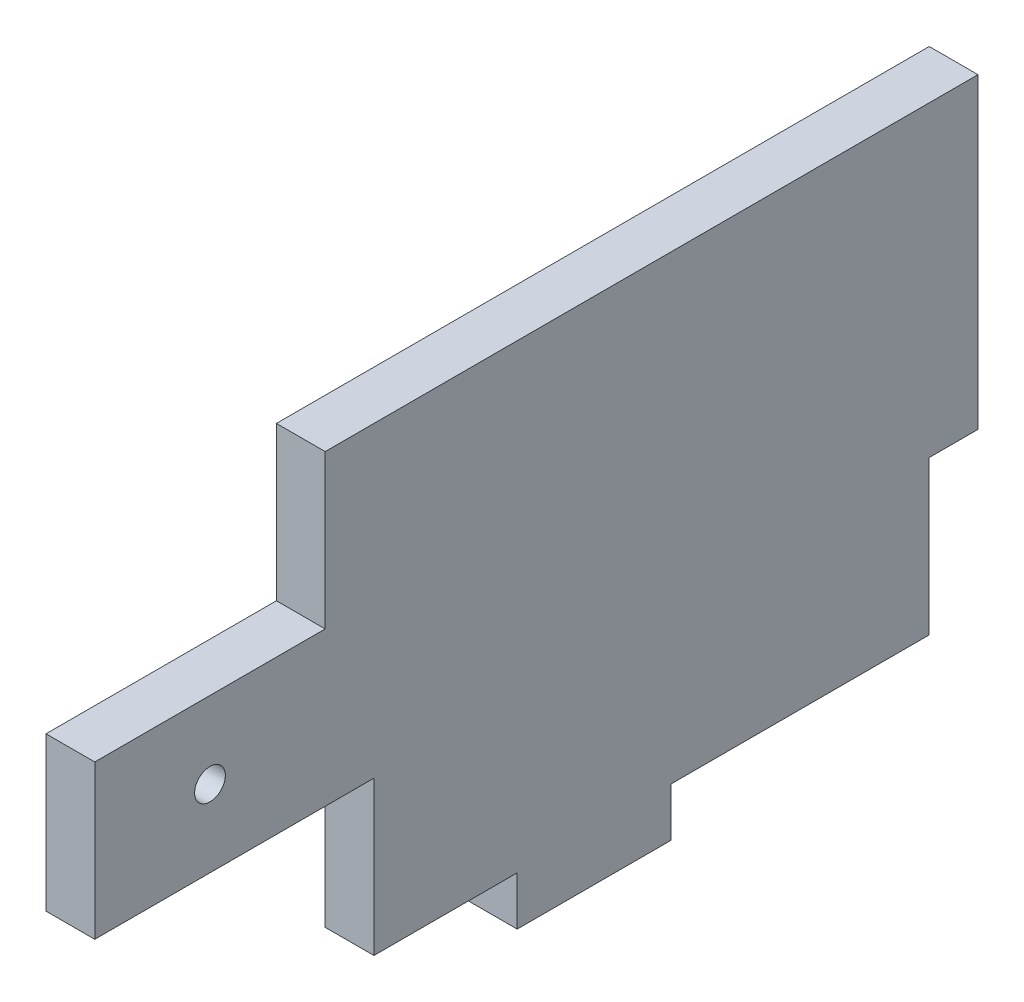
ISO-10303-21;
HEADER;
FILE_DESCRIPTION(('STEP AP214'),'2;1');
FILE_NAME('part.step','',(''),(''),'','','');
FILE_SCHEMA(('AUTOMOTIVE_DESIGN { 1 0 10303 214 1 1 1 1 }'));
ENDSEC;
DATA;
#1=APPLICATION_CONTEXT('core data for automotive mechanical design processes');
#2=APPLICATION_PROTOCOL_DEFINITION('international standard','automotive_design',2000,#1);
#3=PRODUCT_CONTEXT('',#1,'mechanical');
#4=PRODUCT('Part','Part','',(#3));
#5=PRODUCT_RELATED_PRODUCT_CATEGORY('part','',(#4));
#6=PRODUCT_DEFINITION_FORMATION('','',#4);
#7=PRODUCT_DEFINITION_CONTEXT('part definition',#1,'design');
#8=PRODUCT_DEFINITION('design','',#6,#7);
#9=PRODUCT_DEFINITION_SHAPE('','',#8);
#10=(LENGTH_UNIT() NAMED_UNIT(*) SI_UNIT(.MILLI.,.METRE.));
#11=(NAMED_UNIT(*) PLANE_ANGLE_UNIT() SI_UNIT($,.RADIAN.));
#12=(NAMED_UNIT(*) SI_UNIT($,.STERADIAN.) SOLID_ANGLE_UNIT());
#13=UNCERTAINTY_MEASURE_WITH_UNIT(LENGTH_MEASURE(1.E-05),#10,'distance_accuracy_value','');
#14=(GEOMETRIC_REPRESENTATION_CONTEXT(3) GLOBAL_UNCERTAINTY_ASSIGNED_CONTEXT((#13)) GLOBAL_UNIT_ASSIGNED_CONTEXT((#10,
#11,#12)) REPRESENTATION_CONTEXT('',''));
#15=CARTESIAN_POINT('',(0.,0.,0.));
#16=DIRECTION('',(0.,0.,1.));
#17=DIRECTION('',(1.,0.,0.));
#18=AXIS2_PLACEMENT_3D('',#15,#16,#17);
#19=CARTESIAN_POINT('',(12.7,0.,-85.));
#20=DIRECTION('',(0.,0.,1.));
#21=DIRECTION('',(1.,0.,0.));
#22=AXIS2_PLACEMENT_3D('',#19,#20,#21);
#23=PLANE('',#22);
#24=DIRECTION('',(0.,1.,0.));
#25=VECTOR('',#24,1.);
#26=CARTESIAN_POINT('',(12.7,0.,-85.));
#27=LINE('',#26,#25);
#28=CARTESIAN_POINT('',(12.7,-19.9999999999996,-85.));
#29=VERTEX_POINT('',#28);
#30=CARTESIAN_POINT('',(12.7,60.,-85.));
#31=VERTEX_POINT('',#30);
#32=EDGE_CURVE('E241',#29,#31,#27,.T.);
#33=ORIENTED_EDGE('',*,*,#32,.F.);
#34=DIRECTION('',(1.,0.,0.));
#35=VECTOR('',#34,1.);
#36=CARTESIAN_POINT('',(0.,-19.9999999999996,-85.));
#37=LINE('',#36,#35);
#38=CARTESIAN_POINT('',(0.,-19.9999999999996,-85.));
#39=VERTEX_POINT('',#38);
#40=EDGE_CURVE('E288',#39,#29,#37,.T.);
#41=ORIENTED_EDGE('',*,*,#40,.F.);
#42=DIRECTION('',(0.,1.,0.));
#43=VECTOR('',#42,1.);
#44=CARTESIAN_POINT('',(0.,0.,-85.));
#45=LINE('',#44,#43);
#46=CARTESIAN_POINT('',(0.,60.,-85.));
#47=VERTEX_POINT('',#46);
#48=EDGE_CURVE('E256',#39,#47,#45,.T.);
#49=ORIENTED_EDGE('',*,*,#48,.T.);
#50=DIRECTION('',(-1.,0.,0.));
#51=VECTOR('',#50,1.);
#52=CARTESIAN_POINT('',(12.7,60.,-85.));
#53=LINE('',#52,#51);
#54=EDGE_CURVE('E171',#31,#47,#53,.T.);
#55=ORIENTED_EDGE('',*,*,#54,.F.);
#56=EDGE_LOOP('',(#33,#41,#49,#55));
#57=FACE_BOUND('',#56,.T.);
#58=ADVANCED_FACE('F71',(#57),#23,.F.);
#59=CARTESIAN_POINT('',(12.7,60.,0.));
#60=DIRECTION('',(0.,1.,0.));
#61=DIRECTION('',(0.,0.,1.));
#62=AXIS2_PLACEMENT_3D('',#59,#60,#61);
#63=PLANE('',#62);
#64=DIRECTION('',(0.,0.,-1.));
#65=VECTOR('',#64,1.);
#66=CARTESIAN_POINT('',(0.,60.,0.));
#67=LINE('',#66,#65);
#68=CARTESIAN_POINT('',(0.,60.,85.));
#69=VERTEX_POINT('',#68);
#70=EDGE_CURVE('E260',#69,#47,#67,.T.);
#71=ORIENTED_EDGE('',*,*,#70,.F.);
#72=DIRECTION('',(-1.,0.,0.));
#73=VECTOR('',#72,1.);
#74=CARTESIAN_POINT('',(12.7,60.,85.));
#75=LINE('',#74,#73);
#76=CARTESIAN_POINT('',(12.7,60.,85.));
#77=VERTEX_POINT('',#76);
#78=EDGE_CURVE('E180',#77,#69,#75,.T.);
#79=ORIENTED_EDGE('',*,*,#78,.F.);
#80=DIRECTION('',(0.,0.,-1.));
#81=VECTOR('',#80,1.);
#82=CARTESIAN_POINT('',(12.7,60.,0.));
#83=LINE('',#82,#81);
#84=EDGE_CURVE('E246',#77,#31,#83,.T.);
#85=ORIENTED_EDGE('',*,*,#84,.T.);
#86=ORIENTED_EDGE('',*,*,#54,.T.);
#87=EDGE_LOOP('',(#71,#79,#85,#86));
#88=FACE_BOUND('',#87,.T.);
#89=ADVANCED_FACE('F349',(#88),#63,.T.);
#90=CARTESIAN_POINT('',(12.7,-60.,0.));
#91=DIRECTION('',(0.,1.,0.));
#92=DIRECTION('',(0.,0.,1.));
#93=AXIS2_PLACEMENT_3D('',#90,#91,#92);
#94=PLANE('',#93);
#95=DIRECTION('',(0.,0.,-1.));
#96=VECTOR('',#95,1.);
#97=CARTESIAN_POINT('',(12.7,-60.,0.));
#98=LINE('',#97,#96);
#99=CARTESIAN_POINT('',(12.7,-60.,72.3));
#100=VERTEX_POINT('',#99);
#101=CARTESIAN_POINT('',(12.7,-60.,35.));
#102=VERTEX_POINT('',#101);
#103=EDGE_CURVE('E238',#100,#102,#98,.T.);
#104=ORIENTED_EDGE('',*,*,#103,.F.);
#105=DIRECTION('',(1.,0.,0.));
#106=VECTOR('',#105,1.);
#107=CARTESIAN_POINT('',(0.,-60.,72.3));
#108=LINE('',#107,#106);
#109=CARTESIAN_POINT('',(0.,-60.,72.3));
#110=VERTEX_POINT('',#109);
#111=EDGE_CURVE('E227',#110,#100,#108,.T.);
#112=ORIENTED_EDGE('',*,*,#111,.F.);
#113=DIRECTION('',(0.,0.,-1.));
#114=VECTOR('',#113,1.);
#115=CARTESIAN_POINT('',(0.,-60.,0.));
#116=LINE('',#115,#114);
#117=CARTESIAN_POINT('',(0.,-60.,35.));
#118=VERTEX_POINT('',#117);
#119=EDGE_CURVE('E252',#110,#118,#116,.T.);
#120=ORIENTED_EDGE('',*,*,#119,.T.);
#121=DIRECTION('',(-1.,0.,0.));
#122=VECTOR('',#121,1.);
#123=CARTESIAN_POINT('',(12.7,-60.,35.));
#124=LINE('',#123,#122);
#125=EDGE_CURVE('E12',#102,#118,#124,.T.);
#126=ORIENTED_EDGE('',*,*,#125,.F.);
#127=EDGE_LOOP('',(#104,#112,#120,#126));
#128=FACE_BOUND('',#127,.T.);
#129=ADVANCED_FACE('F323',(#128),#94,.F.);
#130=CARTESIAN_POINT('',(0.,0.,0.));
#131=DIRECTION('',(1.,0.,0.));
#132=DIRECTION('',(0.,0.,-1.));
#133=AXIS2_PLACEMENT_3D('',#130,#131,#132);
#134=PLANE('',#133);
#135=CARTESIAN_POINT('',(0.,0.,115.));
#136=DIRECTION('',(1.,0.,0.));
#137=DIRECTION('',(0.,0.,-1.));
#138=AXIS2_PLACEMENT_3D('',#135,#136,#137);
#139=CIRCLE('',#138,4.00000000000001);
#140=CARTESIAN_POINT('',(0.,0.,111.));
#141=VERTEX_POINT('',#140);
#142=EDGE_CURVE('E291',#141,#141,#139,.T.);
#143=ORIENTED_EDGE('',*,*,#142,.T.);
#144=EDGE_LOOP('',(#143));
#145=FACE_BOUND('',#144,.T.);
#146=DIRECTION('',(0.,0.,1.));
#147=VECTOR('',#146,1.);
#148=CARTESIAN_POINT('',(0.,-19.9999999999996,-85.));
#149=LINE('',#148,#147);
#150=CARTESIAN_POINT('',(0.,-19.9999999999996,-72.3));
#151=VERTEX_POINT('',#150);
#152=EDGE_CURVE('E298',#39,#151,#149,.T.);
#153=ORIENTED_EDGE('',*,*,#152,.T.);
#154=DIRECTION('',(0.,-1.,0.));
#155=VECTOR('',#154,1.);
#156=CARTESIAN_POINT('',(0.,-60.,-72.3));
#157=LINE('',#156,#155);
#158=CARTESIAN_POINT('',(0.,-60.,-72.3));
#159=VERTEX_POINT('',#158);
#160=EDGE_CURVE('E302',#151,#159,#157,.T.);
#161=ORIENTED_EDGE('',*,*,#160,.T.);
#162=CARTESIAN_POINT('',(0.,-60.,-5.));
#163=VERTEX_POINT('',#162);
#164=EDGE_CURVE('E218',#163,#159,#116,.T.);
#165=ORIENTED_EDGE('',*,*,#164,.F.);
#166=DIRECTION('',(0.,-1.,0.));
#167=VECTOR('',#166,1.);
#168=CARTESIAN_POINT('',(0.,-60.,-5.));
#169=LINE('',#168,#167);
#170=CARTESIAN_POINT('',(0.,-72.7,-5.));
#171=VERTEX_POINT('',#170);
#172=EDGE_CURVE('E204',#163,#171,#169,.T.);
#173=ORIENTED_EDGE('',*,*,#172,.T.);
#174=DIRECTION('',(0.,0.,-1.));
#175=VECTOR('',#174,1.);
#176=CARTESIAN_POINT('',(0.,-72.7,35.));
#177=LINE('',#176,#175);
#178=CARTESIAN_POINT('',(0.,-72.7,35.));
#179=VERTEX_POINT('',#178);
#180=EDGE_CURVE('E208',#179,#171,#177,.T.);
#181=ORIENTED_EDGE('',*,*,#180,.F.);
#182=DIRECTION('',(0.,-1.,0.));
#183=VECTOR('',#182,1.);
#184=CARTESIAN_POINT('',(0.,-60.,35.));
#185=LINE('',#184,#183);
#186=EDGE_CURVE('E197',#118,#179,#185,.T.);
#187=ORIENTED_EDGE('',*,*,#186,.F.);
#188=ORIENTED_EDGE('',*,*,#119,.F.);
#189=DIRECTION('',(0.,1.,0.));
#190=VECTOR('',#189,1.);
#191=CARTESIAN_POINT('',(0.,-60.,72.3));
#192=LINE('',#191,#190);
#193=CARTESIAN_POINT('',(0.,-19.9999999999998,72.3));
#194=VERTEX_POINT('',#193);
#195=EDGE_CURVE('E159',#110,#194,#192,.T.);
#196=ORIENTED_EDGE('',*,*,#195,.T.);
#197=DIRECTION('',(0.,0.,1.));
#198=VECTOR('',#197,1.);
#199=CARTESIAN_POINT('',(0.,-20.,85.));
#200=LINE('',#199,#198);
#201=CARTESIAN_POINT('',(0.,-20.,145.));
#202=VERTEX_POINT('',#201);
#203=EDGE_CURVE('E136',#194,#202,#200,.T.);
#204=ORIENTED_EDGE('',*,*,#203,.T.);
#205=DIRECTION('',(0.,1.,0.));
#206=VECTOR('',#205,1.);
#207=CARTESIAN_POINT('',(0.,-20.,145.));
#208=LINE('',#207,#206);
#209=CARTESIAN_POINT('',(0.,20.,145.));
#210=VERTEX_POINT('',#209);
#211=EDGE_CURVE('E145',#202,#210,#208,.T.);
#212=ORIENTED_EDGE('',*,*,#211,.T.);
#213=DIRECTION('',(0.,0.,1.));
#214=VECTOR('',#213,1.);
#215=CARTESIAN_POINT('',(0.,20.,85.));
#216=LINE('',#215,#214);
#217=CARTESIAN_POINT('',(0.,20.,85.));
#218=VERTEX_POINT('',#217);
#219=EDGE_CURVE('E152',#218,#210,#216,.T.);
#220=ORIENTED_EDGE('',*,*,#219,.F.);
#221=DIRECTION('',(0.,1.,0.));
#222=VECTOR('',#221,1.);
#223=CARTESIAN_POINT('',(0.,0.,85.));
#224=LINE('',#223,#222);
#225=EDGE_CURVE('E262',#218,#69,#224,.T.);
#226=ORIENTED_EDGE('',*,*,#225,.T.);
#227=ORIENTED_EDGE('',*,*,#70,.T.);
#228=ORIENTED_EDGE('',*,*,#48,.F.);
#229=EDGE_LOOP('',(#153,#161,#165,#173,#181,#187,#188,#196,#204,#212,#220,#226,#227,#228));
#230=FACE_BOUND('',#229,.T.);
#231=ADVANCED_FACE('F156',(#145,#230),#134,.F.);
#232=CARTESIAN_POINT('',(12.7,0.,0.));
#233=DIRECTION('',(1.,0.,0.));
#234=DIRECTION('',(0.,0.,-1.));
#235=AXIS2_PLACEMENT_3D('',#232,#233,#234);
#236=PLANE('',#235);
#237=CARTESIAN_POINT('',(12.7,0.,115.));
#238=DIRECTION('',(1.,0.,0.));
#239=DIRECTION('',(0.,0.,-1.));
#240=AXIS2_PLACEMENT_3D('',#237,#238,#239);
#241=CIRCLE('',#240,4.00000000000001);
#242=CARTESIAN_POINT('',(12.7,0.,111.));
#243=VERTEX_POINT('',#242);
#244=EDGE_CURVE('E284',#243,#243,#241,.T.);
#245=ORIENTED_EDGE('',*,*,#244,.F.);
#246=EDGE_LOOP('',(#245));
#247=FACE_BOUND('',#246,.T.);
#248=DIRECTION('',(0.,-1.,0.));
#249=VECTOR('',#248,1.);
#250=CARTESIAN_POINT('',(12.7,-60.,-72.3));
#251=LINE('',#250,#249);
#252=CARTESIAN_POINT('',(12.7,-19.9999999999996,-72.3));
#253=VERTEX_POINT('',#252);
#254=CARTESIAN_POINT('',(12.7,-60.,-72.3));
#255=VERTEX_POINT('',#254);
#256=EDGE_CURVE('E89',#253,#255,#251,.T.);
#257=ORIENTED_EDGE('',*,*,#256,.F.);
#258=DIRECTION('',(0.,0.,1.));
#259=VECTOR('',#258,1.);
#260=CARTESIAN_POINT('',(12.7,-19.9999999999996,-85.));
#261=LINE('',#260,#259);
#262=EDGE_CURVE('E297',#29,#253,#261,.T.);
#263=ORIENTED_EDGE('',*,*,#262,.F.);
#264=ORIENTED_EDGE('',*,*,#32,.T.);
#265=ORIENTED_EDGE('',*,*,#84,.F.);
#266=DIRECTION('',(0.,1.,0.));
#267=VECTOR('',#266,1.);
#268=CARTESIAN_POINT('',(12.7,0.,85.));
#269=LINE('',#268,#267);
#270=CARTESIAN_POINT('',(12.7,20.,85.));
#271=VERTEX_POINT('',#270);
#272=EDGE_CURVE('E189',#271,#77,#269,.T.);
#273=ORIENTED_EDGE('',*,*,#272,.F.);
#274=DIRECTION('',(0.,0.,1.));
#275=VECTOR('',#274,1.);
#276=CARTESIAN_POINT('',(12.7,20.,85.));
#277=LINE('',#276,#275);
#278=CARTESIAN_POINT('',(12.7,20.,145.));
#279=VERTEX_POINT('',#278);
#280=EDGE_CURVE('E161',#271,#279,#277,.T.);
#281=ORIENTED_EDGE('',*,*,#280,.T.);
#282=DIRECTION('',(0.,1.,0.));
#283=VECTOR('',#282,1.);
#284=CARTESIAN_POINT('',(12.7,-20.,145.));
#285=LINE('',#284,#283);
#286=CARTESIAN_POINT('',(12.7,-20.,145.));
#287=VERTEX_POINT('',#286);
#288=EDGE_CURVE('E164',#287,#279,#285,.T.);
#289=ORIENTED_EDGE('',*,*,#288,.F.);
#290=DIRECTION('',(0.,0.,1.));
#291=VECTOR('',#290,1.);
#292=CARTESIAN_POINT('',(12.7,-20.,85.));
#293=LINE('',#292,#291);
#294=CARTESIAN_POINT('',(12.7,-19.9999999999998,72.3));
#295=VERTEX_POINT('',#294);
#296=EDGE_CURVE('E139',#295,#287,#293,.T.);
#297=ORIENTED_EDGE('',*,*,#296,.F.);
#298=DIRECTION('',(0.,1.,0.));
#299=VECTOR('',#298,1.);
#300=CARTESIAN_POINT('',(12.7,-60.,72.3));
#301=LINE('',#300,#299);
#302=EDGE_CURVE('E235',#100,#295,#301,.T.);
#303=ORIENTED_EDGE('',*,*,#302,.F.);
#304=ORIENTED_EDGE('',*,*,#103,.T.);
#305=DIRECTION('',(0.,-1.,0.));
#306=VECTOR('',#305,1.);
#307=CARTESIAN_POINT('',(12.7,-60.,35.));
#308=LINE('',#307,#306);
#309=CARTESIAN_POINT('',(12.7,-72.7,35.));
#310=VERTEX_POINT('',#309);
#311=EDGE_CURVE('E200',#102,#310,#308,.T.);
#312=ORIENTED_EDGE('',*,*,#311,.T.);
#313=DIRECTION('',(0.,0.,-1.));
#314=VECTOR('',#313,1.);
#315=CARTESIAN_POINT('',(12.7,-72.7,35.));
#316=LINE('',#315,#314);
#317=CARTESIAN_POINT('',(12.7,-72.7,-5.));
#318=VERTEX_POINT('',#317);
#319=EDGE_CURVE('E196',#310,#318,#316,.T.);
#320=ORIENTED_EDGE('',*,*,#319,.T.);
#321=DIRECTION('',(0.,-1.,0.));
#322=VECTOR('',#321,1.);
#323=CARTESIAN_POINT('',(12.7,-60.,-5.));
#324=LINE('',#323,#322);
#325=CARTESIAN_POINT('',(12.7,-60.,-5.));
#326=VERTEX_POINT('',#325);
#327=EDGE_CURVE('E193',#326,#318,#324,.T.);
#328=ORIENTED_EDGE('',*,*,#327,.F.);
#329=EDGE_CURVE('E242',#326,#255,#98,.T.);
#330=ORIENTED_EDGE('',*,*,#329,.T.);
#331=EDGE_LOOP('',(#257,#263,#264,#265,#273,#281,#289,#297,#303,#304,#312,#320,#328,#330));
#332=FACE_BOUND('',#331,.T.);
#333=ADVANCED_FACE('F271',(#247,#332),#236,.T.);
#334=CARTESIAN_POINT('',(12.7,0.,85.));
#335=DIRECTION('',(0.,0.,1.));
#336=DIRECTION('',(1.,0.,0.));
#337=AXIS2_PLACEMENT_3D('',#334,#335,#336);
#338=PLANE('',#337);
#339=DIRECTION('',(-1.,0.,0.));
#340=VECTOR('',#339,1.);
#341=CARTESIAN_POINT('',(12.7,20.,85.));
#342=LINE('',#341,#340);
#343=EDGE_CURVE('E168',#271,#218,#342,.T.);
#344=ORIENTED_EDGE('',*,*,#343,.F.);
#345=ORIENTED_EDGE('',*,*,#272,.T.);
#346=ORIENTED_EDGE('',*,*,#78,.T.);
#347=ORIENTED_EDGE('',*,*,#225,.F.);
#348=EDGE_LOOP('',(#344,#345,#346,#347));
#349=FACE_BOUND('',#348,.T.);
#350=ADVANCED_FACE('F361',(#349),#338,.T.);
#351=ORIENTED_EDGE('',*,*,#164,.T.);
#352=DIRECTION('',(1.,0.,0.));
#353=VECTOR('',#352,1.);
#354=CARTESIAN_POINT('',(0.,-60.,-72.3));
#355=LINE('',#354,#353);
#356=EDGE_CURVE('E277',#159,#255,#355,.T.);
#357=ORIENTED_EDGE('',*,*,#356,.T.);
#358=ORIENTED_EDGE('',*,*,#329,.F.);
#359=DIRECTION('',(-1.,0.,0.));
#360=VECTOR('',#359,1.);
#361=CARTESIAN_POINT('',(12.7,-60.,-5.));
#362=LINE('',#361,#360);
#363=EDGE_CURVE('E81',#326,#163,#362,.T.);
#364=ORIENTED_EDGE('',*,*,#363,.T.);
#365=EDGE_LOOP('',(#351,#357,#358,#364));
#366=FACE_BOUND('',#365,.T.);
#367=ADVANCED_FACE('F276',(#366),#94,.F.);
#368=CARTESIAN_POINT('',(12.7,-20.,145.));
#369=DIRECTION('',(0.,0.,1.));
#370=DIRECTION('',(1.,0.,0.));
#371=AXIS2_PLACEMENT_3D('',#368,#369,#370);
#372=PLANE('',#371);
#373=ORIENTED_EDGE('',*,*,#211,.F.);
#374=DIRECTION('',(-1.,0.,0.));
#375=VECTOR('',#374,1.);
#376=CARTESIAN_POINT('',(12.7,-20.,145.));
#377=LINE('',#376,#375);
#378=EDGE_CURVE('E131',#287,#202,#377,.T.);
#379=ORIENTED_EDGE('',*,*,#378,.F.);
#380=ORIENTED_EDGE('',*,*,#288,.T.);
#381=DIRECTION('',(-1.,0.,0.));
#382=VECTOR('',#381,1.);
#383=CARTESIAN_POINT('',(12.7,20.,145.));
#384=LINE('',#383,#382);
#385=EDGE_CURVE('E75',#279,#210,#384,.T.);
#386=ORIENTED_EDGE('',*,*,#385,.T.);
#387=EDGE_LOOP('',(#373,#379,#380,#386));
#388=FACE_BOUND('',#387,.T.);
#389=ADVANCED_FACE('F146',(#388),#372,.T.);
#390=CARTESIAN_POINT('',(12.7,-20.,85.));
#391=DIRECTION('',(0.,-1.,0.));
#392=DIRECTION('',(0.,0.,-1.));
#393=AXIS2_PLACEMENT_3D('',#390,#391,#392);
#394=PLANE('',#393);
#395=ORIENTED_EDGE('',*,*,#203,.F.);
#396=DIRECTION('',(1.,0.,0.));
#397=VECTOR('',#396,1.);
#398=CARTESIAN_POINT('',(0.,-19.9999999999998,72.3));
#399=LINE('',#398,#397);
#400=EDGE_CURVE('E225',#194,#295,#399,.T.);
#401=ORIENTED_EDGE('',*,*,#400,.T.);
#402=ORIENTED_EDGE('',*,*,#296,.T.);
#403=ORIENTED_EDGE('',*,*,#378,.T.);
#404=EDGE_LOOP('',(#395,#401,#402,#403));
#405=FACE_BOUND('',#404,.T.);
#406=ADVANCED_FACE('F133',(#405),#394,.T.);
#407=CARTESIAN_POINT('',(12.7,20.,85.));
#408=DIRECTION('',(0.,-1.,0.));
#409=DIRECTION('',(0.,0.,-1.));
#410=AXIS2_PLACEMENT_3D('',#407,#408,#409);
#411=PLANE('',#410);
#412=ORIENTED_EDGE('',*,*,#219,.T.);
#413=ORIENTED_EDGE('',*,*,#385,.F.);
#414=ORIENTED_EDGE('',*,*,#280,.F.);
#415=ORIENTED_EDGE('',*,*,#343,.T.);
#416=EDGE_LOOP('',(#412,#413,#414,#415));
#417=FACE_BOUND('',#416,.T.);
#418=ADVANCED_FACE('F73',(#417),#411,.F.);
#419=CARTESIAN_POINT('',(12.7,-72.7,35.));
#420=DIRECTION('',(0.,1.,0.));
#421=DIRECTION('',(0.,0.,1.));
#422=AXIS2_PLACEMENT_3D('',#419,#420,#421);
#423=PLANE('',#422);
#424=ORIENTED_EDGE('',*,*,#180,.T.);
#425=DIRECTION('',(-1.,0.,0.));
#426=VECTOR('',#425,1.);
#427=CARTESIAN_POINT('',(12.7,-72.7,-5.));
#428=LINE('',#427,#426);
#429=EDGE_CURVE('E203',#318,#171,#428,.T.);
#430=ORIENTED_EDGE('',*,*,#429,.F.);
#431=ORIENTED_EDGE('',*,*,#319,.F.);
#432=DIRECTION('',(-1.,0.,0.));
#433=VECTOR('',#432,1.);
#434=CARTESIAN_POINT('',(12.7,-72.7,35.));
#435=LINE('',#434,#433);
#436=EDGE_CURVE('E214',#310,#179,#435,.T.);
#437=ORIENTED_EDGE('',*,*,#436,.T.);
#438=EDGE_LOOP('',(#424,#430,#431,#437));
#439=FACE_BOUND('',#438,.T.);
#440=ADVANCED_FACE('F333',(#439),#423,.F.);
#441=CARTESIAN_POINT('',(12.7,-60.,-5.));
#442=DIRECTION('',(0.,0.,-1.));
#443=DIRECTION('',(0.,1.,0.));
#444=AXIS2_PLACEMENT_3D('',#441,#442,#443);
#445=PLANE('',#444);
#446=ORIENTED_EDGE('',*,*,#172,.F.);
#447=ORIENTED_EDGE('',*,*,#363,.F.);
#448=ORIENTED_EDGE('',*,*,#327,.T.);
#449=ORIENTED_EDGE('',*,*,#429,.T.);
#450=EDGE_LOOP('',(#446,#447,#448,#449));
#451=FACE_BOUND('',#450,.T.);
#452=ADVANCED_FACE('F335',(#451),#445,.T.);
#453=CARTESIAN_POINT('',(12.7,-60.,35.));
#454=DIRECTION('',(0.,0.,-1.));
#455=DIRECTION('',(0.,1.,0.));
#456=AXIS2_PLACEMENT_3D('',#453,#454,#455);
#457=PLANE('',#456);
#458=ORIENTED_EDGE('',*,*,#186,.T.);
#459=ORIENTED_EDGE('',*,*,#436,.F.);
#460=ORIENTED_EDGE('',*,*,#311,.F.);
#461=ORIENTED_EDGE('',*,*,#125,.T.);
#462=EDGE_LOOP('',(#458,#459,#460,#461));
#463=FACE_BOUND('',#462,.T.);
#464=ADVANCED_FACE('F329',(#463),#457,.F.);
#465=CARTESIAN_POINT('',(0.,-60.,72.3));
#466=DIRECTION('',(0.,0.,-1.));
#467=DIRECTION('',(-1.,0.,0.));
#468=AXIS2_PLACEMENT_3D('',#465,#466,#467);
#469=PLANE('',#468);
#470=ORIENTED_EDGE('',*,*,#302,.T.);
#471=ORIENTED_EDGE('',*,*,#400,.F.);
#472=ORIENTED_EDGE('',*,*,#195,.F.);
#473=ORIENTED_EDGE('',*,*,#111,.T.);
#474=EDGE_LOOP('',(#470,#471,#472,#473));
#475=FACE_BOUND('',#474,.T.);
#476=ADVANCED_FACE('F313',(#475),#469,.F.);
#477=CARTESIAN_POINT('',(0.,-60.,-72.3));
#478=DIRECTION('',(0.,0.,1.));
#479=DIRECTION('',(1.,0.,0.));
#480=AXIS2_PLACEMENT_3D('',#477,#478,#479);
#481=PLANE('',#480);
#482=ORIENTED_EDGE('',*,*,#256,.T.);
#483=ORIENTED_EDGE('',*,*,#356,.F.);
#484=ORIENTED_EDGE('',*,*,#160,.F.);
#485=DIRECTION('',(1.,0.,0.));
#486=VECTOR('',#485,1.);
#487=CARTESIAN_POINT('',(0.,-19.9999999999996,-72.3));
#488=LINE('',#487,#486);
#489=EDGE_CURVE('E283',#151,#253,#488,.T.);
#490=ORIENTED_EDGE('',*,*,#489,.T.);
#491=EDGE_LOOP('',(#482,#483,#484,#490));
#492=FACE_BOUND('',#491,.T.);
#493=ADVANCED_FACE('F346',(#492),#481,.F.);
#494=CARTESIAN_POINT('',(0.,-19.9999999999996,-85.));
#495=DIRECTION('',(0.,1.,0.));
#496=DIRECTION('',(0.,0.,1.));
#497=AXIS2_PLACEMENT_3D('',#494,#495,#496);
#498=PLANE('',#497);
#499=ORIENTED_EDGE('',*,*,#262,.T.);
#500=ORIENTED_EDGE('',*,*,#489,.F.);
#501=ORIENTED_EDGE('',*,*,#152,.F.);
#502=ORIENTED_EDGE('',*,*,#40,.T.);
#503=EDGE_LOOP('',(#499,#500,#501,#502));
#504=FACE_BOUND('',#503,.T.);
#505=ADVANCED_FACE('F387',(#504),#498,.F.);
#506=CARTESIAN_POINT('',(0.,0.,115.));
#507=DIRECTION('',(1.,0.,0.));
#508=DIRECTION('',(0.,0.,-1.));
#509=AXIS2_PLACEMENT_3D('',#506,#507,#508);
#510=CYLINDRICAL_SURFACE('',#509,4.00000000000001);
#511=ORIENTED_EDGE('',*,*,#142,.F.);
#512=EDGE_LOOP('',(#511));
#513=FACE_BOUND('',#512,.T.);
#514=ORIENTED_EDGE('',*,*,#244,.T.);
#515=EDGE_LOOP('',(#514));
#516=FACE_BOUND('',#515,.T.);
#517=ADVANCED_FACE('F395',(#513,#516),#510,.F.);
#518=CLOSED_SHELL('',(#58,#89,#129,#231,#333,#350,#367,#389,#406,#418,#440,#452,#464,#476,#493,
#505,#517));
#519=MANIFOLD_SOLID_BREP('B2',#518);
#520=ADVANCED_BREP_SHAPE_REPRESENTATION('',(#18,#519),#14);
#521=SHAPE_DEFINITION_REPRESENTATION(#9,#520);
ENDSEC;
END-ISO-10303-21;
